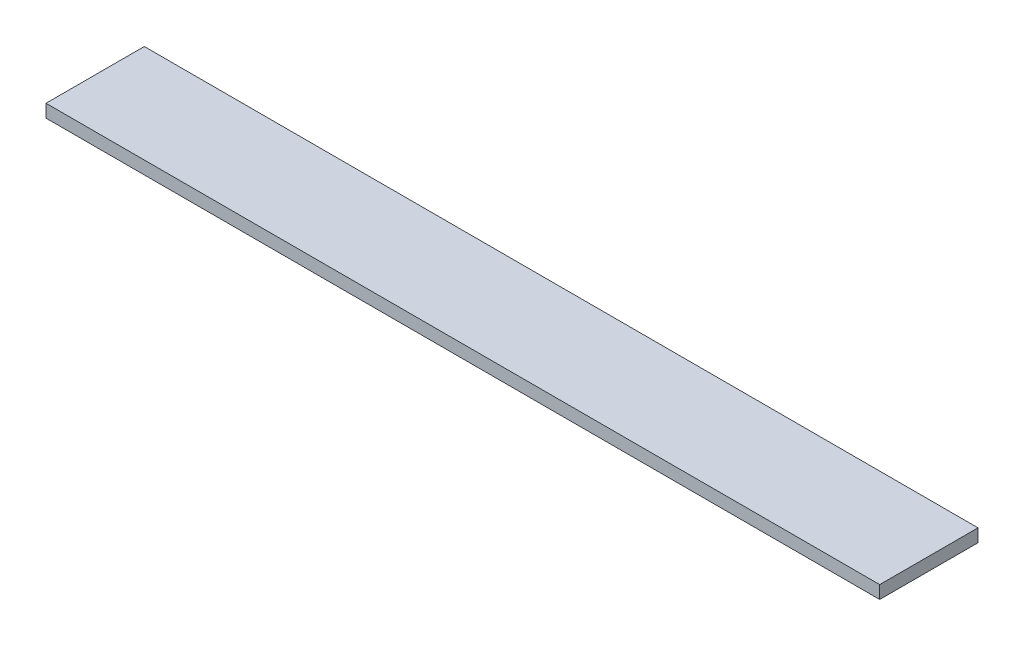
ISO-10303-21;
HEADER;
FILE_DESCRIPTION(('STEP AP214'),'2;1');
FILE_NAME('part.step','',(''),(''),'','','');
FILE_SCHEMA(('AUTOMOTIVE_DESIGN { 1 0 10303 214 1 1 1 1 }'));
ENDSEC;
DATA;
#1=APPLICATION_CONTEXT('core data for automotive mechanical design processes');
#2=APPLICATION_PROTOCOL_DEFINITION('international standard','automotive_design',2000,#1);
#3=PRODUCT_CONTEXT('',#1,'mechanical');
#4=PRODUCT('Part','Part','',(#3));
#5=PRODUCT_RELATED_PRODUCT_CATEGORY('part','',(#4));
#6=PRODUCT_DEFINITION_FORMATION('','',#4);
#7=PRODUCT_DEFINITION_CONTEXT('part definition',#1,'design');
#8=PRODUCT_DEFINITION('design','',#6,#7);
#9=PRODUCT_DEFINITION_SHAPE('','',#8);
#10=(LENGTH_UNIT() NAMED_UNIT(*) SI_UNIT(.MILLI.,.METRE.));
#11=(NAMED_UNIT(*) PLANE_ANGLE_UNIT() SI_UNIT($,.RADIAN.));
#12=(NAMED_UNIT(*) SI_UNIT($,.STERADIAN.) SOLID_ANGLE_UNIT());
#13=UNCERTAINTY_MEASURE_WITH_UNIT(LENGTH_MEASURE(1.E-05),#10,'distance_accuracy_value','');
#14=(GEOMETRIC_REPRESENTATION_CONTEXT(3) GLOBAL_UNCERTAINTY_ASSIGNED_CONTEXT((#13)) GLOBAL_UNIT_ASSIGNED_CONTEXT((#10,
#11,#12)) REPRESENTATION_CONTEXT('',''));
#15=CARTESIAN_POINT('',(0.,0.,0.));
#16=DIRECTION('',(0.,0.,1.));
#17=DIRECTION('',(1.,0.,0.));
#18=AXIS2_PLACEMENT_3D('',#15,#16,#17);
#19=CARTESIAN_POINT('',(322.5,10.,38.0236075526411));
#20=DIRECTION('',(-1.,0.,0.));
#21=DIRECTION('',(0.,0.,1.));
#22=AXIS2_PLACEMENT_3D('',#19,#20,#21);
#23=PLANE('',#22);
#24=DIRECTION('',(0.,0.,-1.));
#25=VECTOR('',#24,1.);
#26=CARTESIAN_POINT('',(322.5,0.,38.0236075526411));
#27=LINE('',#26,#25);
#28=CARTESIAN_POINT('',(322.5,0.,38.0236075526411));
#29=VERTEX_POINT('',#28);
#30=CARTESIAN_POINT('',(322.5,0.,-38.0236075526411));
#31=VERTEX_POINT('',#30);
#32=EDGE_CURVE('E113',#29,#31,#27,.T.);
#33=ORIENTED_EDGE('',*,*,#32,.T.);
#34=DIRECTION('',(0.,-1.,0.));
#35=VECTOR('',#34,1.);
#36=CARTESIAN_POINT('',(322.5,10.,-38.0236075526411));
#37=LINE('',#36,#35);
#38=CARTESIAN_POINT('',(322.5,10.,-38.0236075526411));
#39=VERTEX_POINT('',#38);
#40=EDGE_CURVE('E11',#39,#31,#37,.T.);
#41=ORIENTED_EDGE('',*,*,#40,.F.);
#42=DIRECTION('',(0.,0.,-1.));
#43=VECTOR('',#42,1.);
#44=CARTESIAN_POINT('',(322.5,10.,38.0236075526411));
#45=LINE('',#44,#43);
#46=CARTESIAN_POINT('',(322.5,10.,38.0236075526411));
#47=VERTEX_POINT('',#46);
#48=EDGE_CURVE('E97',#47,#39,#45,.T.);
#49=ORIENTED_EDGE('',*,*,#48,.F.);
#50=DIRECTION('',(0.,-1.,0.));
#51=VECTOR('',#50,1.);
#52=CARTESIAN_POINT('',(322.5,10.,38.0236075526411));
#53=LINE('',#52,#51);
#54=EDGE_CURVE('E109',#47,#29,#53,.T.);
#55=ORIENTED_EDGE('',*,*,#54,.T.);
#56=EDGE_LOOP('',(#33,#41,#49,#55));
#57=FACE_BOUND('',#56,.T.);
#58=ADVANCED_FACE('F45',(#57),#23,.F.);
#59=CARTESIAN_POINT('',(-322.5,10.,-38.0236075526411));
#60=DIRECTION('',(0.,0.,1.));
#61=DIRECTION('',(1.,0.,0.));
#62=AXIS2_PLACEMENT_3D('',#59,#60,#61);
#63=PLANE('',#62);
#64=DIRECTION('',(-1.,0.,0.));
#65=VECTOR('',#64,1.);
#66=CARTESIAN_POINT('',(-322.5,0.,-38.0236075526411));
#67=LINE('',#66,#65);
#68=CARTESIAN_POINT('',(-322.5,0.,-38.0236075526411));
#69=VERTEX_POINT('',#68);
#70=EDGE_CURVE('E102',#31,#69,#67,.T.);
#71=ORIENTED_EDGE('',*,*,#70,.T.);
#72=DIRECTION('',(0.,-1.,0.));
#73=VECTOR('',#72,1.);
#74=CARTESIAN_POINT('',(-322.5,10.,-38.0236075526411));
#75=LINE('',#74,#73);
#76=CARTESIAN_POINT('',(-322.5,10.,-38.0236075526411));
#77=VERTEX_POINT('',#76);
#78=EDGE_CURVE('E54',#77,#69,#75,.T.);
#79=ORIENTED_EDGE('',*,*,#78,.F.);
#80=DIRECTION('',(-1.,0.,0.));
#81=VECTOR('',#80,1.);
#82=CARTESIAN_POINT('',(-322.5,10.,-38.0236075526411));
#83=LINE('',#82,#81);
#84=EDGE_CURVE('E92',#39,#77,#83,.T.);
#85=ORIENTED_EDGE('',*,*,#84,.F.);
#86=ORIENTED_EDGE('',*,*,#40,.T.);
#87=EDGE_LOOP('',(#71,#79,#85,#86));
#88=FACE_BOUND('',#87,.T.);
#89=ADVANCED_FACE('F101',(#88),#63,.F.);
#90=CARTESIAN_POINT('',(-322.5,10.,38.0236075526411));
#91=DIRECTION('',(1.,0.,0.));
#92=DIRECTION('',(0.,0.,-1.));
#93=AXIS2_PLACEMENT_3D('',#90,#91,#92);
#94=PLANE('',#93);
#95=DIRECTION('',(0.,0.,1.));
#96=VECTOR('',#95,1.);
#97=CARTESIAN_POINT('',(-322.5,0.,38.0236075526411));
#98=LINE('',#97,#96);
#99=CARTESIAN_POINT('',(-322.5,0.,38.0236075526411));
#100=VERTEX_POINT('',#99);
#101=EDGE_CURVE('E79',#69,#100,#98,.T.);
#102=ORIENTED_EDGE('',*,*,#101,.T.);
#103=DIRECTION('',(0.,-1.,0.));
#104=VECTOR('',#103,1.);
#105=CARTESIAN_POINT('',(-322.5,10.,38.0236075526411));
#106=LINE('',#105,#104);
#107=CARTESIAN_POINT('',(-322.5,10.,38.0236075526411));
#108=VERTEX_POINT('',#107);
#109=EDGE_CURVE('E104',#108,#100,#106,.T.);
#110=ORIENTED_EDGE('',*,*,#109,.F.);
#111=DIRECTION('',(0.,0.,1.));
#112=VECTOR('',#111,1.);
#113=CARTESIAN_POINT('',(-322.5,10.,38.0236075526411));
#114=LINE('',#113,#112);
#115=EDGE_CURVE('E95',#77,#108,#114,.T.);
#116=ORIENTED_EDGE('',*,*,#115,.F.);
#117=ORIENTED_EDGE('',*,*,#78,.T.);
#118=EDGE_LOOP('',(#102,#110,#116,#117));
#119=FACE_BOUND('',#118,.T.);
#120=ADVANCED_FACE('F105',(#119),#94,.F.);
#121=CARTESIAN_POINT('',(-322.5,10.,38.0236075526411));
#122=DIRECTION('',(0.,0.,-1.));
#123=DIRECTION('',(-1.,0.,0.));
#124=AXIS2_PLACEMENT_3D('',#121,#122,#123);
#125=PLANE('',#124);
#126=DIRECTION('',(1.,0.,0.));
#127=VECTOR('',#126,1.);
#128=CARTESIAN_POINT('',(-322.5,0.,38.0236075526411));
#129=LINE('',#128,#127);
#130=EDGE_CURVE('E85',#100,#29,#129,.T.);
#131=ORIENTED_EDGE('',*,*,#130,.T.);
#132=ORIENTED_EDGE('',*,*,#54,.F.);
#133=DIRECTION('',(1.,0.,0.));
#134=VECTOR('',#133,1.);
#135=CARTESIAN_POINT('',(-322.5,10.,38.0236075526411));
#136=LINE('',#135,#134);
#137=EDGE_CURVE('E62',#108,#47,#136,.T.);
#138=ORIENTED_EDGE('',*,*,#137,.F.);
#139=ORIENTED_EDGE('',*,*,#109,.T.);
#140=EDGE_LOOP('',(#131,#132,#138,#139));
#141=FACE_BOUND('',#140,.T.);
#142=ADVANCED_FACE('F126',(#141),#125,.F.);
#143=CARTESIAN_POINT('',(0.,10.,0.));
#144=DIRECTION('',(0.,-1.,0.));
#145=DIRECTION('',(0.,0.,-1.));
#146=AXIS2_PLACEMENT_3D('',#143,#144,#145);
#147=PLANE('',#146);
#148=ORIENTED_EDGE('',*,*,#48,.T.);
#149=ORIENTED_EDGE('',*,*,#84,.T.);
#150=ORIENTED_EDGE('',*,*,#115,.T.);
#151=ORIENTED_EDGE('',*,*,#137,.T.);
#152=EDGE_LOOP('',(#148,#149,#150,#151));
#153=FACE_BOUND('',#152,.T.);
#154=ADVANCED_FACE('F93',(#153),#147,.F.);
#155=CARTESIAN_POINT('',(0.,0.,0.));
#156=DIRECTION('',(0.,-1.,0.));
#157=DIRECTION('',(0.,0.,-1.));
#158=AXIS2_PLACEMENT_3D('',#155,#156,#157);
#159=PLANE('',#158);
#160=ORIENTED_EDGE('',*,*,#32,.F.);
#161=ORIENTED_EDGE('',*,*,#130,.F.);
#162=ORIENTED_EDGE('',*,*,#101,.F.);
#163=ORIENTED_EDGE('',*,*,#70,.F.);
#164=EDGE_LOOP('',(#160,#161,#162,#163));
#165=FACE_BOUND('',#164,.T.);
#166=ADVANCED_FACE('F129',(#165),#159,.T.);
#167=CLOSED_SHELL('',(#58,#89,#120,#142,#154,#166));
#168=MANIFOLD_SOLID_BREP('B2',#167);
#169=ADVANCED_BREP_SHAPE_REPRESENTATION('',(#18,#168),#14);
#170=SHAPE_DEFINITION_REPRESENTATION(#9,#169);
ENDSEC;
END-ISO-10303-21;
